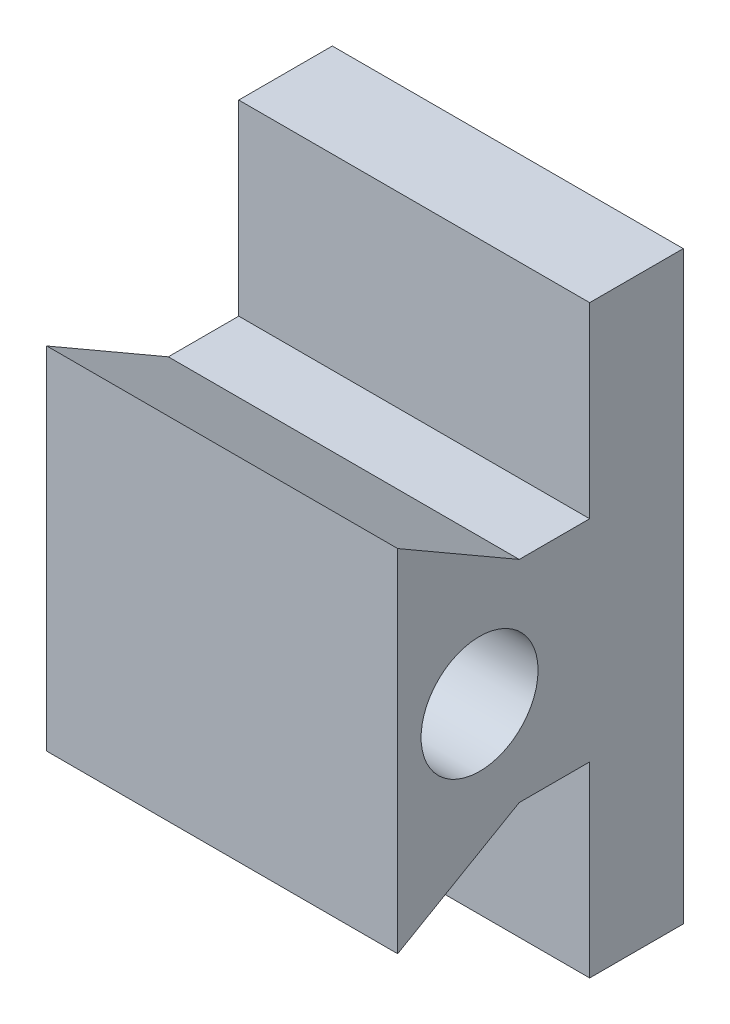
ISO-10303-21;
HEADER;
FILE_DESCRIPTION(('STEP AP214'),'2;1');
FILE_NAME('part.step','',(''),(''),'','','');
FILE_SCHEMA(('AUTOMOTIVE_DESIGN { 1 0 10303 214 1 1 1 1 }'));
ENDSEC;
DATA;
#1=APPLICATION_CONTEXT('core data for automotive mechanical design processes');
#2=APPLICATION_PROTOCOL_DEFINITION('international standard','automotive_design',2000,#1);
#3=PRODUCT_CONTEXT('',#1,'mechanical');
#4=PRODUCT('Part','Part','',(#3));
#5=PRODUCT_RELATED_PRODUCT_CATEGORY('part','',(#4));
#6=PRODUCT_DEFINITION_FORMATION('','',#4);
#7=PRODUCT_DEFINITION_CONTEXT('part definition',#1,'design');
#8=PRODUCT_DEFINITION('design','',#6,#7);
#9=PRODUCT_DEFINITION_SHAPE('','',#8);
#10=(LENGTH_UNIT() NAMED_UNIT(*) SI_UNIT(.MILLI.,.METRE.));
#11=(NAMED_UNIT(*) PLANE_ANGLE_UNIT() SI_UNIT($,.RADIAN.));
#12=(NAMED_UNIT(*) SI_UNIT($,.STERADIAN.) SOLID_ANGLE_UNIT());
#13=UNCERTAINTY_MEASURE_WITH_UNIT(LENGTH_MEASURE(1.E-05),#10,'distance_accuracy_value','');
#14=(GEOMETRIC_REPRESENTATION_CONTEXT(3) GLOBAL_UNCERTAINTY_ASSIGNED_CONTEXT((#13)) GLOBAL_UNIT_ASSIGNED_CONTEXT((#10,
#11,#12)) REPRESENTATION_CONTEXT('',''));
#15=CARTESIAN_POINT('',(0.,0.,0.));
#16=DIRECTION('',(0.,0.,1.));
#17=DIRECTION('',(1.,0.,0.));
#18=AXIS2_PLACEMENT_3D('',#15,#16,#17);
#19=CARTESIAN_POINT('',(3.,-0.9,-1.03923048454132));
#20=DIRECTION('',(0.,0.866025403784436,0.500000000000004));
#21=DIRECTION('',(0.,-0.500000000000004,0.866025403784436));
#22=AXIS2_PLACEMENT_3D('',#19,#20,#21);
#23=PLANE('',#22);
#24=DIRECTION('',(0.,0.500000000000004,-0.866025403784436));
#25=VECTOR('',#24,1.);
#26=CARTESIAN_POINT('',(0.,-0.9,-1.03923048454132));
#27=LINE('',#26,#25);
#28=CARTESIAN_POINT('',(0.,-1.5,0.));
#29=VERTEX_POINT('',#28);
#30=CARTESIAN_POINT('',(0.,-0.9,-1.03923048454132));
#31=VERTEX_POINT('',#30);
#32=EDGE_CURVE('E152',#29,#31,#27,.T.);
#33=ORIENTED_EDGE('',*,*,#32,.T.);
#34=DIRECTION('',(-1.,0.,0.));
#35=VECTOR('',#34,1.);
#36=CARTESIAN_POINT('',(3.,-0.9,-1.03923048454132));
#37=LINE('',#36,#35);
#38=CARTESIAN_POINT('',(3.,-0.9,-1.03923048454132));
#39=VERTEX_POINT('',#38);
#40=EDGE_CURVE('E13',#39,#31,#37,.T.);
#41=ORIENTED_EDGE('',*,*,#40,.F.);
#42=DIRECTION('',(0.,0.500000000000004,-0.866025403784436));
#43=VECTOR('',#42,1.);
#44=CARTESIAN_POINT('',(3.,-0.9,-1.03923048454132));
#45=LINE('',#44,#43);
#46=CARTESIAN_POINT('',(3.,-1.5,0.));
#47=VERTEX_POINT('',#46);
#48=EDGE_CURVE('E171',#47,#39,#45,.T.);
#49=ORIENTED_EDGE('',*,*,#48,.F.);
#50=DIRECTION('',(-1.,0.,0.));
#51=VECTOR('',#50,1.);
#52=CARTESIAN_POINT('',(3.,-1.5,0.));
#53=LINE('',#52,#51);
#54=EDGE_CURVE('E148',#47,#29,#53,.T.);
#55=ORIENTED_EDGE('',*,*,#54,.T.);
#56=EDGE_LOOP('',(#33,#41,#49,#55));
#57=FACE_BOUND('',#56,.T.);
#58=ADVANCED_FACE('F44',(#57),#23,.F.);
#59=CARTESIAN_POINT('',(3.,-0.9,-1.03923048454132));
#60=DIRECTION('',(0.,1.,0.));
#61=DIRECTION('',(0.,0.,1.));
#62=AXIS2_PLACEMENT_3D('',#59,#60,#61);
#63=PLANE('',#62);
#64=DIRECTION('',(0.,0.,-1.));
#65=VECTOR('',#64,1.);
#66=CARTESIAN_POINT('',(0.,-0.9,-1.03923048454132));
#67=LINE('',#66,#65);
#68=CARTESIAN_POINT('',(0.,-0.9,-1.64129041622761));
#69=VERTEX_POINT('',#68);
#70=EDGE_CURVE('E155',#31,#69,#67,.T.);
#71=ORIENTED_EDGE('',*,*,#70,.T.);
#72=DIRECTION('',(-1.,0.,0.));
#73=VECTOR('',#72,1.);
#74=CARTESIAN_POINT('',(3.,-0.9,-1.64129041622761));
#75=LINE('',#74,#73);
#76=CARTESIAN_POINT('',(3.,-0.9,-1.64129041622761));
#77=VERTEX_POINT('',#76);
#78=EDGE_CURVE('E52',#77,#69,#75,.T.);
#79=ORIENTED_EDGE('',*,*,#78,.F.);
#80=DIRECTION('',(0.,0.,-1.));
#81=VECTOR('',#80,1.);
#82=CARTESIAN_POINT('',(3.,-0.9,-1.03923048454132));
#83=LINE('',#82,#81);
#84=EDGE_CURVE('E109',#39,#77,#83,.T.);
#85=ORIENTED_EDGE('',*,*,#84,.F.);
#86=ORIENTED_EDGE('',*,*,#40,.T.);
#87=EDGE_LOOP('',(#71,#79,#85,#86));
#88=FACE_BOUND('',#87,.T.);
#89=ADVANCED_FACE('F241',(#88),#63,.F.);
#90=CARTESIAN_POINT('',(3.,-0.9,-1.64129041622761));
#91=DIRECTION('',(0.,0.,-1.));
#92=DIRECTION('',(0.,1.,0.));
#93=AXIS2_PLACEMENT_3D('',#90,#91,#92);
#94=PLANE('',#93);
#95=DIRECTION('',(0.,-1.,0.));
#96=VECTOR('',#95,1.);
#97=CARTESIAN_POINT('',(0.,-0.9,-1.64129041622761));
#98=LINE('',#97,#96);
#99=CARTESIAN_POINT('',(0.,-2.5,-1.64129041622761));
#100=VERTEX_POINT('',#99);
#101=EDGE_CURVE('E158',#69,#100,#98,.T.);
#102=ORIENTED_EDGE('',*,*,#101,.T.);
#103=DIRECTION('',(-1.,0.,0.));
#104=VECTOR('',#103,1.);
#105=CARTESIAN_POINT('',(3.,-2.5,-1.64129041622761));
#106=LINE('',#105,#104);
#107=CARTESIAN_POINT('',(3.,-2.5,-1.64129041622761));
#108=VERTEX_POINT('',#107);
#109=EDGE_CURVE('E184',#108,#100,#106,.T.);
#110=ORIENTED_EDGE('',*,*,#109,.F.);
#111=DIRECTION('',(0.,-1.,0.));
#112=VECTOR('',#111,1.);
#113=CARTESIAN_POINT('',(3.,-0.9,-1.64129041622761));
#114=LINE('',#113,#112);
#115=EDGE_CURVE('E192',#77,#108,#114,.T.);
#116=ORIENTED_EDGE('',*,*,#115,.F.);
#117=ORIENTED_EDGE('',*,*,#78,.T.);
#118=EDGE_LOOP('',(#102,#110,#116,#117));
#119=FACE_BOUND('',#118,.T.);
#120=ADVANCED_FACE('F190',(#119),#94,.F.);
#121=CARTESIAN_POINT('',(3.,-2.5,-2.44129041622761));
#122=DIRECTION('',(0.,1.,0.));
#123=DIRECTION('',(0.,0.,1.));
#124=AXIS2_PLACEMENT_3D('',#121,#122,#123);
#125=PLANE('',#124);
#126=DIRECTION('',(0.,0.,-1.));
#127=VECTOR('',#126,1.);
#128=CARTESIAN_POINT('',(0.,-2.5,-2.44129041622761));
#129=LINE('',#128,#127);
#130=CARTESIAN_POINT('',(0.,-2.5,-2.44129041622761));
#131=VERTEX_POINT('',#130);
#132=EDGE_CURVE('E160',#100,#131,#129,.T.);
#133=ORIENTED_EDGE('',*,*,#132,.T.);
#134=DIRECTION('',(-1.,0.,0.));
#135=VECTOR('',#134,1.);
#136=CARTESIAN_POINT('',(3.,-2.5,-2.44129041622761));
#137=LINE('',#136,#135);
#138=CARTESIAN_POINT('',(3.,-2.5,-2.44129041622761));
#139=VERTEX_POINT('',#138);
#140=EDGE_CURVE('E181',#139,#131,#137,.T.);
#141=ORIENTED_EDGE('',*,*,#140,.F.);
#142=DIRECTION('',(0.,0.,-1.));
#143=VECTOR('',#142,1.);
#144=CARTESIAN_POINT('',(3.,-2.5,-2.44129041622761));
#145=LINE('',#144,#143);
#146=EDGE_CURVE('E210',#108,#139,#145,.T.);
#147=ORIENTED_EDGE('',*,*,#146,.F.);
#148=ORIENTED_EDGE('',*,*,#109,.T.);
#149=EDGE_LOOP('',(#133,#141,#147,#148));
#150=FACE_BOUND('',#149,.T.);
#151=ADVANCED_FACE('F201',(#150),#125,.F.);
#152=CARTESIAN_POINT('',(3.,2.5,-2.44129041622761));
#153=DIRECTION('',(0.,0.,1.));
#154=DIRECTION('',(1.,0.,0.));
#155=AXIS2_PLACEMENT_3D('',#152,#153,#154);
#156=PLANE('',#155);
#157=DIRECTION('',(0.,1.,0.));
#158=VECTOR('',#157,1.);
#159=CARTESIAN_POINT('',(0.,2.5,-2.44129041622761));
#160=LINE('',#159,#158);
#161=CARTESIAN_POINT('',(0.,2.5,-2.44129041622761));
#162=VERTEX_POINT('',#161);
#163=EDGE_CURVE('E162',#131,#162,#160,.T.);
#164=ORIENTED_EDGE('',*,*,#163,.T.);
#165=DIRECTION('',(-1.,0.,0.));
#166=VECTOR('',#165,1.);
#167=CARTESIAN_POINT('',(3.,2.5,-2.44129041622761));
#168=LINE('',#167,#166);
#169=CARTESIAN_POINT('',(3.,2.5,-2.44129041622761));
#170=VERTEX_POINT('',#169);
#171=EDGE_CURVE('E178',#170,#162,#168,.T.);
#172=ORIENTED_EDGE('',*,*,#171,.F.);
#173=DIRECTION('',(0.,1.,0.));
#174=VECTOR('',#173,1.);
#175=CARTESIAN_POINT('',(3.,2.5,-2.44129041622761));
#176=LINE('',#175,#174);
#177=EDGE_CURVE('E207',#139,#170,#176,.T.);
#178=ORIENTED_EDGE('',*,*,#177,.F.);
#179=ORIENTED_EDGE('',*,*,#140,.T.);
#180=EDGE_LOOP('',(#164,#172,#178,#179));
#181=FACE_BOUND('',#180,.T.);
#182=ADVANCED_FACE('F205',(#181),#156,.F.);
#183=CARTESIAN_POINT('',(3.,2.5,-1.64129041622761));
#184=DIRECTION('',(0.,-1.,0.));
#185=DIRECTION('',(0.,0.,-1.));
#186=AXIS2_PLACEMENT_3D('',#183,#184,#185);
#187=PLANE('',#186);
#188=DIRECTION('',(0.,0.,1.));
#189=VECTOR('',#188,1.);
#190=CARTESIAN_POINT('',(0.,2.5,-1.64129041622761));
#191=LINE('',#190,#189);
#192=CARTESIAN_POINT('',(0.,2.5,-1.64129041622761));
#193=VERTEX_POINT('',#192);
#194=EDGE_CURVE('E164',#162,#193,#191,.T.);
#195=ORIENTED_EDGE('',*,*,#194,.T.);
#196=DIRECTION('',(-1.,0.,0.));
#197=VECTOR('',#196,1.);
#198=CARTESIAN_POINT('',(3.,2.5,-1.64129041622761));
#199=LINE('',#198,#197);
#200=CARTESIAN_POINT('',(3.,2.5,-1.64129041622761));
#201=VERTEX_POINT('',#200);
#202=EDGE_CURVE('E175',#201,#193,#199,.T.);
#203=ORIENTED_EDGE('',*,*,#202,.F.);
#204=DIRECTION('',(0.,0.,1.));
#205=VECTOR('',#204,1.);
#206=CARTESIAN_POINT('',(3.,2.5,-1.64129041622761));
#207=LINE('',#206,#205);
#208=EDGE_CURVE('E209',#170,#201,#207,.T.);
#209=ORIENTED_EDGE('',*,*,#208,.F.);
#210=ORIENTED_EDGE('',*,*,#171,.T.);
#211=EDGE_LOOP('',(#195,#203,#209,#210));
#212=FACE_BOUND('',#211,.T.);
#213=ADVANCED_FACE('F253',(#212),#187,.F.);
#214=CARTESIAN_POINT('',(3.,0.9,-1.64129041622761));
#215=DIRECTION('',(0.,0.,-1.));
#216=DIRECTION('',(0.,1.,0.));
#217=AXIS2_PLACEMENT_3D('',#214,#215,#216);
#218=PLANE('',#217);
#219=DIRECTION('',(0.,-1.,0.));
#220=VECTOR('',#219,1.);
#221=CARTESIAN_POINT('',(0.,0.9,-1.64129041622761));
#222=LINE('',#221,#220);
#223=CARTESIAN_POINT('',(0.,0.9,-1.64129041622761));
#224=VERTEX_POINT('',#223);
#225=EDGE_CURVE('E166',#193,#224,#222,.T.);
#226=ORIENTED_EDGE('',*,*,#225,.T.);
#227=DIRECTION('',(-1.,0.,0.));
#228=VECTOR('',#227,1.);
#229=CARTESIAN_POINT('',(3.,0.9,-1.64129041622761));
#230=LINE('',#229,#228);
#231=CARTESIAN_POINT('',(3.,0.9,-1.64129041622761));
#232=VERTEX_POINT('',#231);
#233=EDGE_CURVE('E143',#232,#224,#230,.T.);
#234=ORIENTED_EDGE('',*,*,#233,.F.);
#235=DIRECTION('',(0.,-1.,0.));
#236=VECTOR('',#235,1.);
#237=CARTESIAN_POINT('',(3.,0.9,-1.64129041622761));
#238=LINE('',#237,#236);
#239=EDGE_CURVE('E134',#201,#232,#238,.T.);
#240=ORIENTED_EDGE('',*,*,#239,.F.);
#241=ORIENTED_EDGE('',*,*,#202,.T.);
#242=EDGE_LOOP('',(#226,#234,#240,#241));
#243=FACE_BOUND('',#242,.T.);
#244=ADVANCED_FACE('F250',(#243),#218,.F.);
#245=CARTESIAN_POINT('',(3.,0.9,-1.03923048454131));
#246=DIRECTION('',(0.,-1.,0.));
#247=DIRECTION('',(0.,0.,-1.));
#248=AXIS2_PLACEMENT_3D('',#245,#246,#247);
#249=PLANE('',#248);
#250=DIRECTION('',(0.,0.,1.));
#251=VECTOR('',#250,1.);
#252=CARTESIAN_POINT('',(0.,0.9,-1.03923048454131));
#253=LINE('',#252,#251);
#254=CARTESIAN_POINT('',(0.,0.9,-1.03923048454131));
#255=VERTEX_POINT('',#254);
#256=EDGE_CURVE('E142',#224,#255,#253,.T.);
#257=ORIENTED_EDGE('',*,*,#256,.T.);
#258=DIRECTION('',(-1.,0.,0.));
#259=VECTOR('',#258,1.);
#260=CARTESIAN_POINT('',(3.,0.9,-1.03923048454131));
#261=LINE('',#260,#259);
#262=CARTESIAN_POINT('',(3.,0.9,-1.03923048454131));
#263=VERTEX_POINT('',#262);
#264=EDGE_CURVE('E139',#263,#255,#261,.T.);
#265=ORIENTED_EDGE('',*,*,#264,.F.);
#266=DIRECTION('',(0.,0.,1.));
#267=VECTOR('',#266,1.);
#268=CARTESIAN_POINT('',(3.,0.9,-1.03923048454131));
#269=LINE('',#268,#267);
#270=EDGE_CURVE('E128',#232,#263,#269,.T.);
#271=ORIENTED_EDGE('',*,*,#270,.F.);
#272=ORIENTED_EDGE('',*,*,#233,.T.);
#273=EDGE_LOOP('',(#257,#265,#271,#272));
#274=FACE_BOUND('',#273,.T.);
#275=ADVANCED_FACE('F140',(#274),#249,.F.);
#276=CARTESIAN_POINT('',(3.,1.5,0.));
#277=DIRECTION('',(0.,-0.866025403784436,0.500000000000004));
#278=DIRECTION('',(0.,-0.500000000000004,-0.866025403784436));
#279=AXIS2_PLACEMENT_3D('',#276,#277,#278);
#280=PLANE('',#279);
#281=DIRECTION('',(0.,0.500000000000004,0.866025403784436));
#282=VECTOR('',#281,1.);
#283=CARTESIAN_POINT('',(0.,1.5,0.));
#284=LINE('',#283,#282);
#285=CARTESIAN_POINT('',(0.,1.5,0.));
#286=VERTEX_POINT('',#285);
#287=EDGE_CURVE('E95',#255,#286,#284,.T.);
#288=ORIENTED_EDGE('',*,*,#287,.T.);
#289=DIRECTION('',(-1.,0.,0.));
#290=VECTOR('',#289,1.);
#291=CARTESIAN_POINT('',(3.,1.5,0.));
#292=LINE('',#291,#290);
#293=CARTESIAN_POINT('',(3.,1.5,0.));
#294=VERTEX_POINT('',#293);
#295=EDGE_CURVE('E144',#294,#286,#292,.T.);
#296=ORIENTED_EDGE('',*,*,#295,.F.);
#297=DIRECTION('',(0.,0.500000000000004,0.866025403784436));
#298=VECTOR('',#297,1.);
#299=CARTESIAN_POINT('',(3.,1.5,0.));
#300=LINE('',#299,#298);
#301=EDGE_CURVE('E132',#263,#294,#300,.T.);
#302=ORIENTED_EDGE('',*,*,#301,.F.);
#303=ORIENTED_EDGE('',*,*,#264,.T.);
#304=EDGE_LOOP('',(#288,#296,#302,#303));
#305=FACE_BOUND('',#304,.T.);
#306=ADVANCED_FACE('F146',(#305),#280,.F.);
#307=CARTESIAN_POINT('',(3.,-1.5,0.));
#308=DIRECTION('',(0.,0.,-1.));
#309=DIRECTION('',(-1.,0.,0.));
#310=AXIS2_PLACEMENT_3D('',#307,#308,#309);
#311=PLANE('',#310);
#312=DIRECTION('',(0.,-1.,0.));
#313=VECTOR('',#312,1.);
#314=CARTESIAN_POINT('',(0.,-1.5,0.));
#315=LINE('',#314,#313);
#316=EDGE_CURVE('E101',#286,#29,#315,.T.);
#317=ORIENTED_EDGE('',*,*,#316,.T.);
#318=ORIENTED_EDGE('',*,*,#54,.F.);
#319=DIRECTION('',(0.,-1.,0.));
#320=VECTOR('',#319,1.);
#321=CARTESIAN_POINT('',(3.,-1.5,0.));
#322=LINE('',#321,#320);
#323=EDGE_CURVE('E60',#294,#47,#322,.T.);
#324=ORIENTED_EDGE('',*,*,#323,.F.);
#325=ORIENTED_EDGE('',*,*,#295,.T.);
#326=EDGE_LOOP('',(#317,#318,#324,#325));
#327=FACE_BOUND('',#326,.T.);
#328=ADVANCED_FACE('F232',(#327),#311,.F.);
#329=CARTESIAN_POINT('',(3.,0.,0.));
#330=DIRECTION('',(-1.,0.,0.));
#331=DIRECTION('',(0.,0.,1.));
#332=AXIS2_PLACEMENT_3D('',#329,#330,#331);
#333=PLANE('',#332);
#334=CARTESIAN_POINT('',(3.,0.,-0.7));
#335=DIRECTION('',(1.,0.,0.));
#336=DIRECTION('',(0.,0.,-1.));
#337=AXIS2_PLACEMENT_3D('',#334,#335,#336);
#338=CIRCLE('',#337,0.500000000000001);
#339=CARTESIAN_POINT('',(3.,0.,-1.2));
#340=VERTEX_POINT('',#339);
#341=EDGE_CURVE('E218',#340,#340,#338,.T.);
#342=ORIENTED_EDGE('',*,*,#341,.F.);
#343=EDGE_LOOP('',(#342));
#344=FACE_BOUND('',#343,.T.);
#345=ORIENTED_EDGE('',*,*,#48,.T.);
#346=ORIENTED_EDGE('',*,*,#84,.T.);
#347=ORIENTED_EDGE('',*,*,#115,.T.);
#348=ORIENTED_EDGE('',*,*,#146,.T.);
#349=ORIENTED_EDGE('',*,*,#177,.T.);
#350=ORIENTED_EDGE('',*,*,#208,.T.);
#351=ORIENTED_EDGE('',*,*,#239,.T.);
#352=ORIENTED_EDGE('',*,*,#270,.T.);
#353=ORIENTED_EDGE('',*,*,#301,.T.);
#354=ORIENTED_EDGE('',*,*,#323,.T.);
#355=EDGE_LOOP('',(#345,#346,#347,#348,#349,#350,#351,#352,#353,#354));
#356=FACE_BOUND('',#355,.T.);
#357=ADVANCED_FACE('F130',(#344,#356),#333,.F.);
#358=CARTESIAN_POINT('',(0.,0.,0.));
#359=DIRECTION('',(-1.,0.,0.));
#360=DIRECTION('',(0.,0.,1.));
#361=AXIS2_PLACEMENT_3D('',#358,#359,#360);
#362=PLANE('',#361);
#363=CARTESIAN_POINT('',(0.,0.,-0.7));
#364=DIRECTION('',(1.,0.,0.));
#365=DIRECTION('',(0.,0.,-1.));
#366=AXIS2_PLACEMENT_3D('',#363,#364,#365);
#367=CIRCLE('',#366,0.500000000000001);
#368=CARTESIAN_POINT('',(0.,0.,-1.2));
#369=VERTEX_POINT('',#368);
#370=EDGE_CURVE('E156',#369,#369,#367,.T.);
#371=ORIENTED_EDGE('',*,*,#370,.T.);
#372=EDGE_LOOP('',(#371));
#373=FACE_BOUND('',#372,.T.);
#374=ORIENTED_EDGE('',*,*,#32,.F.);
#375=ORIENTED_EDGE('',*,*,#316,.F.);
#376=ORIENTED_EDGE('',*,*,#287,.F.);
#377=ORIENTED_EDGE('',*,*,#256,.F.);
#378=ORIENTED_EDGE('',*,*,#225,.F.);
#379=ORIENTED_EDGE('',*,*,#194,.F.);
#380=ORIENTED_EDGE('',*,*,#163,.F.);
#381=ORIENTED_EDGE('',*,*,#132,.F.);
#382=ORIENTED_EDGE('',*,*,#101,.F.);
#383=ORIENTED_EDGE('',*,*,#70,.F.);
#384=EDGE_LOOP('',(#374,#375,#376,#377,#378,#379,#380,#381,#382,#383));
#385=FACE_BOUND('',#384,.T.);
#386=ADVANCED_FACE('F196',(#373,#385),#362,.T.);
#387=CARTESIAN_POINT('',(0.,0.,-0.7));
#388=DIRECTION('',(1.,0.,0.));
#389=DIRECTION('',(0.,0.,-1.));
#390=AXIS2_PLACEMENT_3D('',#387,#388,#389);
#391=CYLINDRICAL_SURFACE('',#390,0.500000000000001);
#392=ORIENTED_EDGE('',*,*,#370,.F.);
#393=EDGE_LOOP('',(#392));
#394=FACE_BOUND('',#393,.T.);
#395=ORIENTED_EDGE('',*,*,#341,.T.);
#396=EDGE_LOOP('',(#395));
#397=FACE_BOUND('',#396,.T.);
#398=ADVANCED_FACE('F225',(#394,#397),#391,.F.);
#399=CLOSED_SHELL('',(#58,#89,#120,#151,#182,#213,#244,#275,#306,#328,#357,#386,#398));
#400=MANIFOLD_SOLID_BREP('B2',#399);
#401=ADVANCED_BREP_SHAPE_REPRESENTATION('',(#18,#400),#14);
#402=SHAPE_DEFINITION_REPRESENTATION(#9,#401);
ENDSEC;
END-ISO-10303-21;
